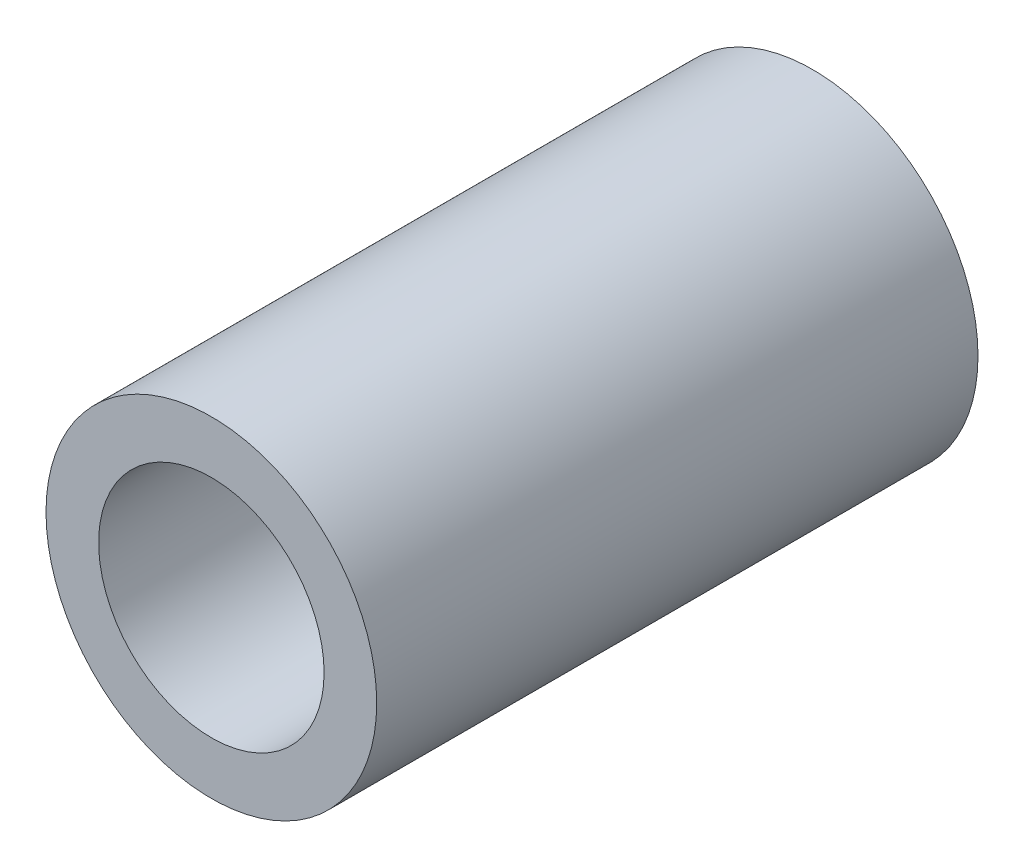
ISO-10303-21;
HEADER;
FILE_DESCRIPTION(('STEP AP214'),'2;1');
FILE_NAME('part.step','',(''),(''),'','','');
FILE_SCHEMA(('AUTOMOTIVE_DESIGN { 1 0 10303 214 1 1 1 1 }'));
ENDSEC;
DATA;
#1=APPLICATION_CONTEXT('core data for automotive mechanical design processes');
#2=APPLICATION_PROTOCOL_DEFINITION('international standard','automotive_design',2000,#1);
#3=PRODUCT_CONTEXT('',#1,'mechanical');
#4=PRODUCT('Part','Part','',(#3));
#5=PRODUCT_RELATED_PRODUCT_CATEGORY('part','',(#4));
#6=PRODUCT_DEFINITION_FORMATION('','',#4);
#7=PRODUCT_DEFINITION_CONTEXT('part definition',#1,'design');
#8=PRODUCT_DEFINITION('design','',#6,#7);
#9=PRODUCT_DEFINITION_SHAPE('','',#8);
#10=(LENGTH_UNIT() NAMED_UNIT(*) SI_UNIT(.MILLI.,.METRE.));
#11=(NAMED_UNIT(*) PLANE_ANGLE_UNIT() SI_UNIT($,.RADIAN.));
#12=(NAMED_UNIT(*) SI_UNIT($,.STERADIAN.) SOLID_ANGLE_UNIT());
#13=UNCERTAINTY_MEASURE_WITH_UNIT(LENGTH_MEASURE(1.E-05),#10,'distance_accuracy_value','');
#14=(GEOMETRIC_REPRESENTATION_CONTEXT(3) GLOBAL_UNCERTAINTY_ASSIGNED_CONTEXT((#13)) GLOBAL_UNIT_ASSIGNED_CONTEXT((#10,
#11,#12)) REPRESENTATION_CONTEXT('',''));
#15=CARTESIAN_POINT('',(0.,0.,0.));
#16=DIRECTION('',(0.,0.,1.));
#17=DIRECTION('',(1.,0.,0.));
#18=AXIS2_PLACEMENT_3D('',#15,#16,#17);
#19=CARTESIAN_POINT('',(-42.149607093937,34.9398058805004,8.));
#20=DIRECTION('',(0.,0.,1.));
#21=DIRECTION('',(1.,0.,0.));
#22=AXIS2_PLACEMENT_3D('',#19,#20,#21);
#23=PLANE('',#22);
#24=CARTESIAN_POINT('',(-42.149607093937,34.9398058805004,8.));
#25=DIRECTION('',(0.,0.,1.));
#26=DIRECTION('',(1.,0.,0.));
#27=AXIS2_PLACEMENT_3D('',#24,#25,#26);
#28=CIRCLE('',#27,2.2);
#29=CARTESIAN_POINT('',(-39.949607093937,34.9398058805004,8.));
#30=VERTEX_POINT('',#29);
#31=EDGE_CURVE('E10',#30,#30,#28,.T.);
#32=ORIENTED_EDGE('',*,*,#31,.T.);
#33=EDGE_LOOP('',(#32));
#34=FACE_BOUND('',#33,.T.);
#35=CARTESIAN_POINT('',(-42.149607093937,34.9398058805004,8.));
#36=DIRECTION('',(0.,0.,1.));
#37=DIRECTION('',(1.,0.,0.));
#38=AXIS2_PLACEMENT_3D('',#35,#36,#37);
#39=CIRCLE('',#38,1.5);
#40=CARTESIAN_POINT('',(-40.649607093937,34.9398058805004,8.));
#41=VERTEX_POINT('',#40);
#42=EDGE_CURVE('E46',#41,#41,#39,.T.);
#43=ORIENTED_EDGE('',*,*,#42,.F.);
#44=EDGE_LOOP('',(#43));
#45=FACE_BOUND('',#44,.T.);
#46=ADVANCED_FACE('F35',(#34,#45),#23,.T.);
#47=CARTESIAN_POINT('',(-42.149607093937,34.9398058805004,0.));
#48=DIRECTION('',(0.,0.,1.));
#49=DIRECTION('',(1.,0.,0.));
#50=AXIS2_PLACEMENT_3D('',#47,#48,#49);
#51=PLANE('',#50);
#52=CARTESIAN_POINT('',(-42.149607093937,34.9398058805004,0.));
#53=DIRECTION('',(0.,0.,1.));
#54=DIRECTION('',(1.,0.,0.));
#55=AXIS2_PLACEMENT_3D('',#52,#53,#54);
#56=CIRCLE('',#55,2.2);
#57=CARTESIAN_POINT('',(-39.949607093937,34.9398058805004,0.));
#58=VERTEX_POINT('',#57);
#59=EDGE_CURVE('E39',#58,#58,#56,.T.);
#60=ORIENTED_EDGE('',*,*,#59,.F.);
#61=EDGE_LOOP('',(#60));
#62=FACE_BOUND('',#61,.T.);
#63=CARTESIAN_POINT('',(-42.149607093937,34.9398058805004,0.));
#64=DIRECTION('',(0.,0.,1.));
#65=DIRECTION('',(1.,0.,0.));
#66=AXIS2_PLACEMENT_3D('',#63,#64,#65);
#67=CIRCLE('',#66,1.5);
#68=CARTESIAN_POINT('',(-40.649607093937,34.9398058805004,0.));
#69=VERTEX_POINT('',#68);
#70=EDGE_CURVE('E48',#69,#69,#67,.T.);
#71=ORIENTED_EDGE('',*,*,#70,.T.);
#72=EDGE_LOOP('',(#71));
#73=FACE_BOUND('',#72,.T.);
#74=ADVANCED_FACE('F58',(#62,#73),#51,.F.);
#75=CARTESIAN_POINT('',(-42.149607093937,34.9398058805004,8.));
#76=DIRECTION('',(0.,0.,-1.));
#77=DIRECTION('',(-1.,0.,0.));
#78=AXIS2_PLACEMENT_3D('',#75,#76,#77);
#79=CYLINDRICAL_SURFACE('',#78,2.2);
#80=ORIENTED_EDGE('',*,*,#31,.F.);
#81=EDGE_LOOP('',(#80));
#82=FACE_BOUND('',#81,.T.);
#83=ORIENTED_EDGE('',*,*,#59,.T.);
#84=EDGE_LOOP('',(#83));
#85=FACE_BOUND('',#84,.T.);
#86=ADVANCED_FACE('F37',(#82,#85),#79,.T.);
#87=CARTESIAN_POINT('',(-42.149607093937,34.9398058805004,8.));
#88=DIRECTION('',(0.,0.,-1.));
#89=DIRECTION('',(-1.,0.,0.));
#90=AXIS2_PLACEMENT_3D('',#87,#88,#89);
#91=CYLINDRICAL_SURFACE('',#90,1.5);
#92=ORIENTED_EDGE('',*,*,#42,.T.);
#93=EDGE_LOOP('',(#92));
#94=FACE_BOUND('',#93,.T.);
#95=ORIENTED_EDGE('',*,*,#70,.F.);
#96=EDGE_LOOP('',(#95));
#97=FACE_BOUND('',#96,.T.);
#98=ADVANCED_FACE('F54',(#94,#97),#91,.F.);
#99=CLOSED_SHELL('',(#46,#74,#86,#98));
#100=MANIFOLD_SOLID_BREP('B2',#99);
#101=ADVANCED_BREP_SHAPE_REPRESENTATION('',(#18,#100),#14);
#102=SHAPE_DEFINITION_REPRESENTATION(#9,#101);
ENDSEC;
END-ISO-10303-21;
